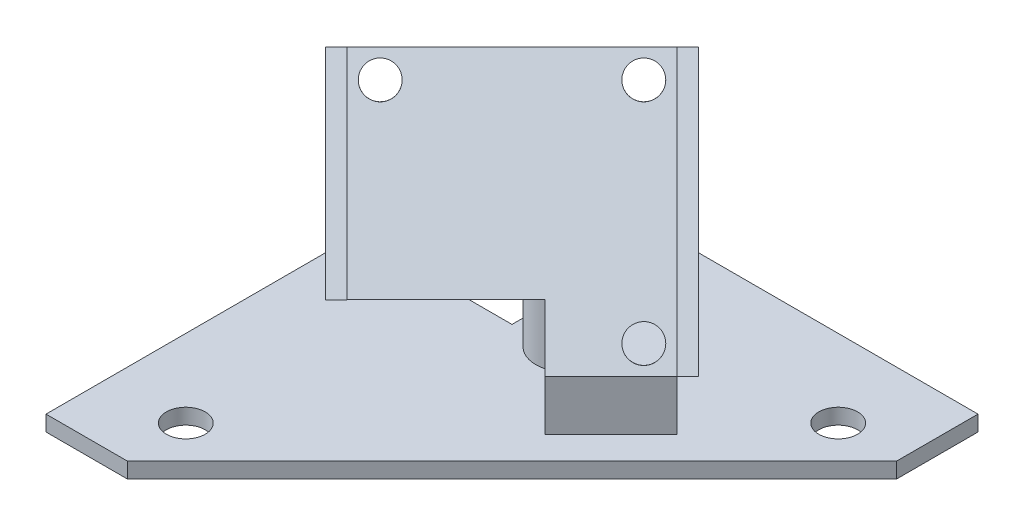
ISO-10303-21;
HEADER;
FILE_DESCRIPTION(('STEP AP214'),'2;1');
FILE_NAME('part.step','',(''),(''),'','','');
FILE_SCHEMA(('AUTOMOTIVE_DESIGN { 1 0 10303 214 1 1 1 1 }'));
ENDSEC;
DATA;
#1=APPLICATION_CONTEXT('core data for automotive mechanical design processes');
#2=APPLICATION_PROTOCOL_DEFINITION('international standard','automotive_design',2000,#1);
#3=PRODUCT_CONTEXT('',#1,'mechanical');
#4=PRODUCT('Part','Part','',(#3));
#5=PRODUCT_RELATED_PRODUCT_CATEGORY('part','',(#4));
#6=PRODUCT_DEFINITION_FORMATION('','',#4);
#7=PRODUCT_DEFINITION_CONTEXT('part definition',#1,'design');
#8=PRODUCT_DEFINITION('design','',#6,#7);
#9=PRODUCT_DEFINITION_SHAPE('','',#8);
#10=(LENGTH_UNIT() NAMED_UNIT(*) SI_UNIT(.MILLI.,.METRE.));
#11=(NAMED_UNIT(*) PLANE_ANGLE_UNIT() SI_UNIT($,.RADIAN.));
#12=(NAMED_UNIT(*) SI_UNIT($,.STERADIAN.) SOLID_ANGLE_UNIT());
#13=UNCERTAINTY_MEASURE_WITH_UNIT(LENGTH_MEASURE(1.E-05),#10,'distance_accuracy_value','');
#14=(GEOMETRIC_REPRESENTATION_CONTEXT(3) GLOBAL_UNCERTAINTY_ASSIGNED_CONTEXT((#13)) GLOBAL_UNIT_ASSIGNED_CONTEXT((#10,
#11,#12)) REPRESENTATION_CONTEXT('',''));
#15=CARTESIAN_POINT('',(0.,0.,0.));
#16=DIRECTION('',(0.,0.,1.));
#17=DIRECTION('',(1.,0.,0.));
#18=AXIS2_PLACEMENT_3D('',#15,#16,#17);
#19=CARTESIAN_POINT('',(10.,2.,52.));
#20=DIRECTION('',(0.,-1.,0.));
#21=DIRECTION('',(0.,0.,-1.));
#22=AXIS2_PLACEMENT_3D('',#19,#20,#21);
#23=CYLINDRICAL_SURFACE('',#22,2.5);
#24=CARTESIAN_POINT('',(10.,5.,52.));
#25=DIRECTION('',(0.,1.,0.));
#26=DIRECTION('',(0.,0.,1.));
#27=AXIS2_PLACEMENT_3D('',#24,#25,#26);
#28=CIRCLE('',#27,2.5);
#29=CARTESIAN_POINT('',(10.,5.,54.5));
#30=VERTEX_POINT('',#29);
#31=EDGE_CURVE('E223',#30,#30,#28,.T.);
#32=ORIENTED_EDGE('',*,*,#31,.T.);
#33=EDGE_LOOP('',(#32));
#34=FACE_BOUND('',#33,.T.);
#35=CARTESIAN_POINT('',(10.,3.,52.));
#36=DIRECTION('',(0.,-1.,0.));
#37=DIRECTION('',(0.,0.,-1.));
#38=AXIS2_PLACEMENT_3D('',#35,#36,#37);
#39=CIRCLE('',#38,2.5);
#40=CARTESIAN_POINT('',(10.,3.,49.5));
#41=VERTEX_POINT('',#40);
#42=EDGE_CURVE('E722',#41,#41,#39,.T.);
#43=ORIENTED_EDGE('',*,*,#42,.T.);
#44=EDGE_LOOP('',(#43));
#45=FACE_BOUND('',#44,.T.);
#46=ADVANCED_FACE('F37',(#34,#45),#23,.F.);
#47=CARTESIAN_POINT('',(52.,2.,10.));
#48=DIRECTION('',(0.,-1.,0.));
#49=DIRECTION('',(0.,0.,-1.));
#50=AXIS2_PLACEMENT_3D('',#47,#48,#49);
#51=CYLINDRICAL_SURFACE('',#50,2.5);
#52=CARTESIAN_POINT('',(52.,5.,10.));
#53=DIRECTION('',(0.,1.,0.));
#54=DIRECTION('',(0.,0.,1.));
#55=AXIS2_PLACEMENT_3D('',#52,#53,#54);
#56=CIRCLE('',#55,2.5);
#57=CARTESIAN_POINT('',(52.,5.,12.5));
#58=VERTEX_POINT('',#57);
#59=EDGE_CURVE('E729',#58,#58,#56,.T.);
#60=ORIENTED_EDGE('',*,*,#59,.T.);
#61=EDGE_LOOP('',(#60));
#62=FACE_BOUND('',#61,.T.);
#63=CARTESIAN_POINT('',(52.,3.,10.));
#64=DIRECTION('',(0.,-1.,0.));
#65=DIRECTION('',(0.,0.,-1.));
#66=AXIS2_PLACEMENT_3D('',#63,#64,#65);
#67=CIRCLE('',#66,2.5);
#68=CARTESIAN_POINT('',(52.,3.,7.5));
#69=VERTEX_POINT('',#68);
#70=EDGE_CURVE('E725',#69,#69,#67,.T.);
#71=ORIENTED_EDGE('',*,*,#70,.T.);
#72=EDGE_LOOP('',(#71));
#73=FACE_BOUND('',#72,.T.);
#74=ADVANCED_FACE('F39',(#62,#73),#51,.F.);
#75=CARTESIAN_POINT('',(60.,2.,0.));
#76=DIRECTION('',(1.,0.,0.));
#77=DIRECTION('',(0.,0.,-1.));
#78=AXIS2_PLACEMENT_3D('',#75,#76,#77);
#79=PLANE('',#78);
#80=DIRECTION('',(0.,-1.,0.));
#81=VECTOR('',#80,1.);
#82=CARTESIAN_POINT('',(60.,2.,10.5025253169417));
#83=LINE('',#82,#81);
#84=CARTESIAN_POINT('',(60.,5.,10.5025253169417));
#85=VERTEX_POINT('',#84);
#86=CARTESIAN_POINT('',(60.,3.,10.5025253169417));
#87=VERTEX_POINT('',#86);
#88=EDGE_CURVE('E182',#85,#87,#83,.T.);
#89=ORIENTED_EDGE('',*,*,#88,.T.);
#90=DIRECTION('',(0.,0.,1.));
#91=VECTOR('',#90,1.);
#92=CARTESIAN_POINT('',(60.,3.,0.));
#93=LINE('',#92,#91);
#94=CARTESIAN_POINT('',(60.,3.,0.));
#95=VERTEX_POINT('',#94);
#96=EDGE_CURVE('E170',#95,#87,#93,.T.);
#97=ORIENTED_EDGE('',*,*,#96,.F.);
#98=DIRECTION('',(0.,-1.,0.));
#99=VECTOR('',#98,1.);
#100=CARTESIAN_POINT('',(60.,2.,0.));
#101=LINE('',#100,#99);
#102=CARTESIAN_POINT('',(60.,5.,0.));
#103=VERTEX_POINT('',#102);
#104=EDGE_CURVE('E180',#103,#95,#101,.T.);
#105=ORIENTED_EDGE('',*,*,#104,.F.);
#106=DIRECTION('',(0.,0.,-1.));
#107=VECTOR('',#106,1.);
#108=CARTESIAN_POINT('',(60.,5.,10.5025253169417));
#109=LINE('',#108,#107);
#110=EDGE_CURVE('E219',#85,#103,#109,.T.);
#111=ORIENTED_EDGE('',*,*,#110,.F.);
#112=EDGE_LOOP('',(#89,#97,#105,#111));
#113=FACE_BOUND('',#112,.T.);
#114=ADVANCED_FACE('F178',(#113),#79,.T.);
#115=CARTESIAN_POINT('',(35.2512626584708,2.,35.2512626584708));
#116=DIRECTION('',(0.707106781186547,0.,0.707106781186547));
#117=DIRECTION('',(0.707106781186548,0.,-0.707106781186548));
#118=AXIS2_PLACEMENT_3D('',#115,#116,#117);
#119=PLANE('',#118);
#120=DIRECTION('',(0.,-1.,0.));
#121=VECTOR('',#120,1.);
#122=CARTESIAN_POINT('',(10.5025253169417,2.,60.));
#123=LINE('',#122,#121);
#124=CARTESIAN_POINT('',(10.5025253169417,5.,60.));
#125=VERTEX_POINT('',#124);
#126=CARTESIAN_POINT('',(10.5025253169417,3.,60.));
#127=VERTEX_POINT('',#126);
#128=EDGE_CURVE('E191',#125,#127,#123,.T.);
#129=ORIENTED_EDGE('',*,*,#128,.T.);
#130=DIRECTION('',(-0.707106781186548,0.,0.707106781186548));
#131=VECTOR('',#130,1.);
#132=CARTESIAN_POINT('',(60.,3.,10.5025253169417));
#133=LINE('',#132,#131);
#134=EDGE_CURVE('E183',#87,#127,#133,.T.);
#135=ORIENTED_EDGE('',*,*,#134,.F.);
#136=ORIENTED_EDGE('',*,*,#88,.F.);
#137=DIRECTION('',(0.707106781186548,0.,-0.707106781186548));
#138=VECTOR('',#137,1.);
#139=CARTESIAN_POINT('',(10.5025253169417,5.,60.));
#140=LINE('',#139,#138);
#141=EDGE_CURVE('E234',#125,#85,#140,.T.);
#142=ORIENTED_EDGE('',*,*,#141,.F.);
#143=EDGE_LOOP('',(#129,#135,#136,#142));
#144=FACE_BOUND('',#143,.T.);
#145=ADVANCED_FACE('F446',(#144),#119,.T.);
#146=CARTESIAN_POINT('',(0.,2.,60.));
#147=DIRECTION('',(0.,0.,-1.));
#148=DIRECTION('',(-1.,0.,0.));
#149=AXIS2_PLACEMENT_3D('',#146,#147,#148);
#150=PLANE('',#149);
#151=DIRECTION('',(-1.,0.,0.));
#152=VECTOR('',#151,1.);
#153=CARTESIAN_POINT('',(10.5025253169417,3.,60.));
#154=LINE('',#153,#152);
#155=CARTESIAN_POINT('',(0.,3.,60.));
#156=VERTEX_POINT('',#155);
#157=EDGE_CURVE('E739',#127,#156,#154,.T.);
#158=ORIENTED_EDGE('',*,*,#157,.F.);
#159=ORIENTED_EDGE('',*,*,#128,.F.);
#160=DIRECTION('',(1.,0.,0.));
#161=VECTOR('',#160,1.);
#162=CARTESIAN_POINT('',(0.,5.,60.));
#163=LINE('',#162,#161);
#164=CARTESIAN_POINT('',(0.,5.,60.));
#165=VERTEX_POINT('',#164);
#166=EDGE_CURVE('E231',#165,#125,#163,.T.);
#167=ORIENTED_EDGE('',*,*,#166,.F.);
#168=DIRECTION('',(0.,-1.,0.));
#169=VECTOR('',#168,1.);
#170=CARTESIAN_POINT('',(0.,2.,60.));
#171=LINE('',#170,#169);
#172=EDGE_CURVE('E200',#165,#156,#171,.T.);
#173=ORIENTED_EDGE('',*,*,#172,.T.);
#174=EDGE_LOOP('',(#158,#159,#167,#173));
#175=FACE_BOUND('',#174,.T.);
#176=ADVANCED_FACE('F442',(#175),#150,.F.);
#177=CARTESIAN_POINT('',(0.,2.,0.));
#178=DIRECTION('',(1.,0.,0.));
#179=DIRECTION('',(0.,0.,-1.));
#180=AXIS2_PLACEMENT_3D('',#177,#178,#179);
#181=PLANE('',#180);
#182=DIRECTION('',(0.,0.,-1.));
#183=VECTOR('',#182,1.);
#184=CARTESIAN_POINT('',(0.,3.,60.));
#185=LINE('',#184,#183);
#186=CARTESIAN_POINT('',(0.,3.,20.));
#187=VERTEX_POINT('',#186);
#188=EDGE_CURVE('E731',#156,#187,#185,.T.);
#189=ORIENTED_EDGE('',*,*,#188,.F.);
#190=ORIENTED_EDGE('',*,*,#172,.F.);
#191=DIRECTION('',(0.,0.,1.));
#192=VECTOR('',#191,1.);
#193=CARTESIAN_POINT('',(0.,5.,20.));
#194=LINE('',#193,#192);
#195=CARTESIAN_POINT('',(0.,5.,20.));
#196=VERTEX_POINT('',#195);
#197=EDGE_CURVE('E228',#196,#165,#194,.T.);
#198=ORIENTED_EDGE('',*,*,#197,.F.);
#199=DIRECTION('',(0.,-1.,0.));
#200=VECTOR('',#199,1.);
#201=CARTESIAN_POINT('',(0.,2.,20.));
#202=LINE('',#201,#200);
#203=EDGE_CURVE('E203',#196,#187,#202,.T.);
#204=ORIENTED_EDGE('',*,*,#203,.T.);
#205=EDGE_LOOP('',(#189,#190,#198,#204));
#206=FACE_BOUND('',#205,.T.);
#207=ADVANCED_FACE('F438',(#206),#181,.F.);
#208=CARTESIAN_POINT('',(0.,2.,20.));
#209=DIRECTION('',(0.,0.,-1.));
#210=DIRECTION('',(-1.,0.,0.));
#211=AXIS2_PLACEMENT_3D('',#208,#209,#210);
#212=PLANE('',#211);
#213=DIRECTION('',(0.,-1.,0.));
#214=VECTOR('',#213,1.);
#215=CARTESIAN_POINT('',(20.,2.,20.));
#216=LINE('',#215,#214);
#217=CARTESIAN_POINT('',(20.,5.,20.));
#218=VERTEX_POINT('',#217);
#219=CARTESIAN_POINT('',(20.,3.,20.));
#220=VERTEX_POINT('',#219);
#221=EDGE_CURVE('E206',#218,#220,#216,.T.);
#222=ORIENTED_EDGE('',*,*,#221,.T.);
#223=DIRECTION('',(1.,0.,0.));
#224=VECTOR('',#223,1.);
#225=CARTESIAN_POINT('',(0.,3.,20.));
#226=LINE('',#225,#224);
#227=EDGE_CURVE('E727',#187,#220,#226,.T.);
#228=ORIENTED_EDGE('',*,*,#227,.F.);
#229=ORIENTED_EDGE('',*,*,#203,.F.);
#230=DIRECTION('',(-1.,0.,0.));
#231=VECTOR('',#230,1.);
#232=CARTESIAN_POINT('',(20.,5.,20.));
#233=LINE('',#232,#231);
#234=EDGE_CURVE('E221',#218,#196,#233,.T.);
#235=ORIENTED_EDGE('',*,*,#234,.F.);
#236=EDGE_LOOP('',(#222,#228,#229,#235));
#237=FACE_BOUND('',#236,.T.);
#238=ADVANCED_FACE('F435',(#237),#212,.T.);
#239=CARTESIAN_POINT('',(20.,2.,0.));
#240=DIRECTION('',(1.,0.,0.));
#241=DIRECTION('',(0.,0.,-1.));
#242=AXIS2_PLACEMENT_3D('',#239,#240,#241);
#243=PLANE('',#242);
#244=DIRECTION('',(0.,0.,-1.));
#245=VECTOR('',#244,1.);
#246=CARTESIAN_POINT('',(20.,3.,20.));
#247=LINE('',#246,#245);
#248=CARTESIAN_POINT('',(20.,3.,0.));
#249=VERTEX_POINT('',#248);
#250=EDGE_CURVE('E52',#220,#249,#247,.T.);
#251=ORIENTED_EDGE('',*,*,#250,.F.);
#252=ORIENTED_EDGE('',*,*,#221,.F.);
#253=DIRECTION('',(0.,0.,1.));
#254=VECTOR('',#253,1.);
#255=CARTESIAN_POINT('',(20.,5.,0.));
#256=LINE('',#255,#254);
#257=CARTESIAN_POINT('',(20.,5.,0.));
#258=VERTEX_POINT('',#257);
#259=EDGE_CURVE('E212',#258,#218,#256,.T.);
#260=ORIENTED_EDGE('',*,*,#259,.F.);
#261=DIRECTION('',(0.,-1.,0.));
#262=VECTOR('',#261,1.);
#263=CARTESIAN_POINT('',(20.,2.,0.));
#264=LINE('',#263,#262);
#265=EDGE_CURVE('E45',#258,#249,#264,.T.);
#266=ORIENTED_EDGE('',*,*,#265,.T.);
#267=EDGE_LOOP('',(#251,#252,#260,#266));
#268=FACE_BOUND('',#267,.T.);
#269=ADVANCED_FACE('F210',(#268),#243,.F.);
#270=CARTESIAN_POINT('',(0.,2.,0.));
#271=DIRECTION('',(0.,0.,-1.));
#272=DIRECTION('',(-1.,0.,0.));
#273=AXIS2_PLACEMENT_3D('',#270,#271,#272);
#274=PLANE('',#273);
#275=ORIENTED_EDGE('',*,*,#104,.T.);
#276=DIRECTION('',(1.,0.,0.));
#277=VECTOR('',#276,1.);
#278=CARTESIAN_POINT('',(20.,3.,0.));
#279=LINE('',#278,#277);
#280=EDGE_CURVE('E167',#249,#95,#279,.T.);
#281=ORIENTED_EDGE('',*,*,#280,.F.);
#282=ORIENTED_EDGE('',*,*,#265,.F.);
#283=DIRECTION('',(-1.,0.,0.));
#284=VECTOR('',#283,1.);
#285=CARTESIAN_POINT('',(60.,5.,0.));
#286=LINE('',#285,#284);
#287=EDGE_CURVE('E187',#103,#258,#286,.T.);
#288=ORIENTED_EDGE('',*,*,#287,.F.);
#289=EDGE_LOOP('',(#275,#281,#282,#288));
#290=FACE_BOUND('',#289,.T.);
#291=ADVANCED_FACE('F185',(#290),#274,.T.);
#292=CARTESIAN_POINT('',(36.083472955532,25.2282933289435,14.8702695199356));
#293=DIRECTION('',(-0.707106781186547,0.,0.707106781186548));
#294=DIRECTION('',(0.707106781186548,0.,0.707106781186547));
#295=AXIS2_PLACEMENT_3D('',#292,#293,#294);
#296=PLANE('',#295);
#297=DIRECTION('',(0.,-1.,0.));
#298=VECTOR('',#297,1.);
#299=CARTESIAN_POINT('',(42.8915475218258,500000.,21.6783440862294));
#300=LINE('',#299,#298);
#301=CARTESIAN_POINT('',(42.8915475218258,11.4779823712564,21.6783440862294));
#302=VERTEX_POINT('',#301);
#303=CARTESIAN_POINT('',(42.8915475218258,5.00000000010914,21.6783440862294));
#304=VERTEX_POINT('',#303);
#305=EDGE_CURVE('E298',#302,#304,#300,.T.);
#306=ORIENTED_EDGE('',*,*,#305,.T.);
#307=DIRECTION('',(-0.707106781186548,0.,-0.707106781186547));
#308=VECTOR('',#307,1.);
#309=CARTESIAN_POINT('',(36.083472955532,5.,14.8702695199356));
#310=LINE('',#309,#308);
#311=CARTESIAN_POINT('',(41.7330915911169,5.,20.5198881555205));
#312=VERTEX_POINT('',#311);
#313=EDGE_CURVE('E60',#304,#312,#310,.T.);
#314=ORIENTED_EDGE('',*,*,#313,.T.);
#315=DIRECTION('',(0.,-1.,0.));
#316=VECTOR('',#315,1.);
#317=CARTESIAN_POINT('',(41.7330915911467,500000.,20.5198881555502));
#318=LINE('',#317,#316);
#319=CARTESIAN_POINT('',(41.7330915911467,10.3308294985543,20.5198881555502));
#320=VERTEX_POINT('',#319);
#321=EDGE_CURVE('E295',#320,#312,#318,.T.);
#322=ORIENTED_EDGE('',*,*,#321,.F.);
#323=DIRECTION('',(-0.57922796533957,-0.573576436351044,-0.57922796533957));
#324=VECTOR('',#323,1.);
#325=CARTESIAN_POINT('',(44.6292314178446,13.1987116803095,23.4160279822481));
#326=LINE('',#325,#324);
#327=EDGE_CURVE('E265',#302,#320,#326,.T.);
#328=ORIENTED_EDGE('',*,*,#327,.F.);
#329=EDGE_LOOP('',(#306,#314,#322,#328));
#330=FACE_BOUND('',#329,.T.);
#331=ADVANCED_FACE('F372',(#330),#296,.F.);
#332=CARTESIAN_POINT('',(26.0301640550348,43.283929457579,18.9590962431693));
#333=DIRECTION('',(0.,-1.,0.));
#334=DIRECTION('',(0.,0.,-1.));
#335=AXIS2_PLACEMENT_3D('',#332,#333,#334);
#336=CYLINDRICAL_SURFACE('',#335,4.);
#337=CARTESIAN_POINT('',(26.0301640550348,5.,18.9590962431693));
#338=DIRECTION('',(0.,1.,0.));
#339=DIRECTION('',(0.,0.,1.));
#340=AXIS2_PLACEMENT_3D('',#337,#338,#339);
#341=CIRCLE('',#340,4.);
#342=CARTESIAN_POINT('',(26.0301640550348,5.,22.9590962431693));
#343=VERTEX_POINT('',#342);
#344=EDGE_CURVE('E242',#343,#343,#341,.T.);
#345=ORIENTED_EDGE('',*,*,#344,.T.);
#346=EDGE_LOOP('',(#345));
#347=FACE_BOUND('',#346,.T.);
#348=CARTESIAN_POINT('',(26.0301640550348,27.7646507935135,18.9590962431693));
#349=DIRECTION('',(0.57922796533957,0.573576436351044,0.57922796533957));
#350=DIRECTION('',(0.405579787672638,-0.819152044288993,0.405579787672638));
#351=AXIS2_PLACEMENT_3D('',#348,#349,#350);
#352=ELLIPSE('',#351,6.97378718248442,4.);
#353=CARTESIAN_POINT('',(28.858591179781,22.052058766545,21.7875233679155));
#354=VERTEX_POINT('',#353);
#355=EDGE_CURVE('E189',#354,#354,#352,.T.);
#356=ORIENTED_EDGE('',*,*,#355,.F.);
#357=EDGE_LOOP('',(#356));
#358=FACE_BOUND('',#357,.T.);
#359=ADVANCED_FACE('F397',(#347,#358),#336,.T.);
#360=CARTESIAN_POINT('',(27.5981915812934,25.2282933289435,23.3555508941741));
#361=DIRECTION('',(-0.707106781186547,0.,0.707106781186548));
#362=DIRECTION('',(0.707106781186548,0.,0.707106781186547));
#363=AXIS2_PLACEMENT_3D('',#360,#361,#362);
#364=PLANE('',#363);
#365=DIRECTION('',(-0.707106781186548,0.,-0.707106781186547));
#366=VECTOR('',#365,1.);
#367=CARTESIAN_POINT('',(27.5981915812934,5.,23.3555508941741));
#368=LINE('',#367,#366);
#369=CARTESIAN_POINT('',(34.4062661475873,4.99999999999545,30.163625460468));
#370=VERTEX_POINT('',#369);
#371=CARTESIAN_POINT('',(33.2478102169095,5.,29.0051695297902));
#372=VERTEX_POINT('',#371);
#373=EDGE_CURVE('E236',#370,#372,#368,.T.);
#374=ORIENTED_EDGE('',*,*,#373,.F.);
#375=DIRECTION('',(0.,-1.,0.));
#376=VECTOR('',#375,1.);
#377=CARTESIAN_POINT('',(34.4062661475873,500000.,30.163625460468));
#378=LINE('',#377,#376);
#379=CARTESIAN_POINT('',(34.4062661475873,11.4779823712564,30.163625460468));
#380=VERTEX_POINT('',#379);
#381=EDGE_CURVE('E301',#380,#370,#378,.T.);
#382=ORIENTED_EDGE('',*,*,#381,.F.);
#383=DIRECTION('',(-0.405579787672638,0.819152044288993,-0.405579787672637));
#384=VECTOR('',#383,1.);
#385=CARTESIAN_POINT('',(27.5981915812934,25.2282933289435,23.3555508941741));
#386=LINE('',#385,#384);
#387=CARTESIAN_POINT('',(31.5672076338788,17.2120466812793,27.3245669467595));
#388=VERTEX_POINT('',#387);
#389=EDGE_CURVE('E311',#380,#388,#386,.T.);
#390=ORIENTED_EDGE('',*,*,#389,.T.);
#391=DIRECTION('',(-0.57922796533957,-0.573576436351044,-0.57922796533957));
#392=VECTOR('',#391,1.);
#393=CARTESIAN_POINT('',(31.5672076338788,17.2120466812793,27.3245669467595));
#394=LINE('',#393,#392);
#395=CARTESIAN_POINT('',(30.4087517031996,16.0648938085772,26.1661110160803));
#396=VERTEX_POINT('',#395);
#397=EDGE_CURVE('E194',#388,#396,#394,.T.);
#398=ORIENTED_EDGE('',*,*,#397,.T.);
#399=DIRECTION('',(-0.405579787672638,0.819152044288993,-0.405579787672637));
#400=VECTOR('',#399,1.);
#401=CARTESIAN_POINT('',(26.4397356506143,24.0811404562414,22.197094963495));
#402=LINE('',#401,#400);
#403=CARTESIAN_POINT('',(33.2478102169109,10.3308294985653,29.0051695297916));
#404=VERTEX_POINT('',#403);
#405=EDGE_CURVE('E336',#404,#396,#402,.T.);
#406=ORIENTED_EDGE('',*,*,#405,.F.);
#407=DIRECTION('',(0.,-1.,0.));
#408=VECTOR('',#407,1.);
#409=CARTESIAN_POINT('',(33.2478102169081,500000.,29.0051695297888));
#410=LINE('',#409,#408);
#411=EDGE_CURVE('E304',#404,#372,#410,.T.);
#412=ORIENTED_EDGE('',*,*,#411,.T.);
#413=EDGE_LOOP('',(#374,#382,#390,#398,#406,#412));
#414=FACE_BOUND('',#413,.T.);
#415=ADVANCED_FACE('F354',(#414),#364,.T.);
#416=CARTESIAN_POINT('',(20.1175521738485,36.0525436999262,20.1175521738485));
#417=DIRECTION('',(0.405579787672638,-0.819152044288993,0.405579787672638));
#418=DIRECTION('',(0.896169137511728,0.443712606279656,0.));
#419=AXIS2_PLACEMENT_3D('',#416,#417,#418);
#420=PLANE('',#419);
#421=DIRECTION('',(-0.707106781186547,0.,0.707106781186548));
#422=VECTOR('',#421,1.);
#423=CARTESIAN_POINT('',(18.9590962431693,34.9053908272241,18.9590962431693));
#424=LINE('',#423,#422);
#425=CARTESIAN_POINT('',(30.9799115233406,34.9053908272241,6.93828096299801));
#426=VERTEX_POINT('',#425);
#427=CARTESIAN_POINT('',(6.93828096299803,34.9053908272241,30.9799115233406));
#428=VERTEX_POINT('',#427);
#429=EDGE_CURVE('E341',#426,#428,#424,.T.);
#430=ORIENTED_EDGE('',*,*,#429,.T.);
#431=DIRECTION('',(-0.57922796533957,-0.573576436351044,-0.57922796533957));
#432=VECTOR('',#431,1.);
#433=CARTESIAN_POINT('',(9.83442078969589,37.7732730089793,33.8760513500385));
#434=LINE('',#433,#432);
#435=CARTESIAN_POINT('',(9.83442078969589,37.7732730089793,33.8760513500385));
#436=VERTEX_POINT('',#435);
#437=EDGE_CURVE('E292',#436,#428,#434,.T.);
#438=ORIENTED_EDGE('',*,*,#437,.F.);
#439=DIRECTION('',(-0.707106781186548,0.,0.707106781186548));
#440=VECTOR('',#439,1.);
#441=CARTESIAN_POINT('',(11.248634352069,37.7732730089793,32.4618377876654));
#442=LINE('',#441,#440);
#443=CARTESIAN_POINT('',(11.248634352069,37.7732730089793,32.4618377876654));
#444=VERTEX_POINT('',#443);
#445=EDGE_CURVE('E275',#444,#436,#442,.T.);
#446=ORIENTED_EDGE('',*,*,#445,.F.);
#447=DIRECTION('',(-0.57922796533957,-0.573576436351044,-0.57922796533957));
#448=VECTOR('',#447,1.);
#449=CARTESIAN_POINT('',(11.248634352069,37.7732730089793,32.4618377876654));
#450=LINE('',#449,#448);
#451=CARTESIAN_POINT('',(9.51095045605027,36.0525436999262,30.7241538916467));
#452=VERTEX_POINT('',#451);
#453=EDGE_CURVE('E284',#444,#452,#450,.T.);
#454=ORIENTED_EDGE('',*,*,#453,.T.);
#455=DIRECTION('',(-0.707106781186547,0.,0.707106781186548));
#456=VECTOR('',#455,1.);
#457=CARTESIAN_POINT('',(20.1175521738485,36.0525436999262,20.1175521738485));
#458=LINE('',#457,#456);
#459=CARTESIAN_POINT('',(30.7241538916467,36.0525436999262,9.51095045605025));
#460=VERTEX_POINT('',#459);
#461=EDGE_CURVE('E321',#460,#452,#458,.T.);
#462=ORIENTED_EDGE('',*,*,#461,.F.);
#463=DIRECTION('',(-0.57922796533957,-0.573576436351044,-0.57922796533957));
#464=VECTOR('',#463,1.);
#465=CARTESIAN_POINT('',(32.4618377876654,37.7732730089793,11.248634352069));
#466=LINE('',#465,#464);
#467=CARTESIAN_POINT('',(32.4618377876654,37.7732730089793,11.248634352069));
#468=VERTEX_POINT('',#467);
#469=EDGE_CURVE('E269',#468,#460,#466,.T.);
#470=ORIENTED_EDGE('',*,*,#469,.F.);
#471=DIRECTION('',(-0.707106781186547,0.,0.707106781186548));
#472=VECTOR('',#471,1.);
#473=CARTESIAN_POINT('',(32.4618377876654,37.7732730089793,11.248634352069));
#474=LINE('',#473,#472);
#475=CARTESIAN_POINT('',(33.8760513500385,37.7732730089793,9.83442078969587));
#476=VERTEX_POINT('',#475);
#477=EDGE_CURVE('E251',#476,#468,#474,.T.);
#478=ORIENTED_EDGE('',*,*,#477,.F.);
#479=DIRECTION('',(-0.57922796533957,-0.573576436351044,-0.57922796533957));
#480=VECTOR('',#479,1.);
#481=CARTESIAN_POINT('',(33.8760513500385,37.7732730089793,9.83442078969587));
#482=LINE('',#481,#480);
#483=EDGE_CURVE('E260',#476,#426,#482,.T.);
#484=ORIENTED_EDGE('',*,*,#483,.T.);
#485=EDGE_LOOP('',(#430,#438,#446,#454,#462,#470,#478,#484));
#486=FACE_BOUND('',#485,.T.);
#487=ADVANCED_FACE('F498',(#486),#420,.F.);
#488=CARTESIAN_POINT('',(12.8490101626278,33.5950875670592,29.819572911105));
#489=DIRECTION('',(-0.57922796533957,-0.573576436351044,-0.57922796533957));
#490=DIRECTION('',(-0.707106781186547,0.,0.707106781186548));
#491=AXIS2_PLACEMENT_3D('',#488,#489,#490);
#492=CYLINDRICAL_SURFACE('',#491,2.);
#493=CARTESIAN_POINT('',(12.8490101626278,33.5950875670592,29.819572911105));
#494=DIRECTION('',(0.57922796533957,0.573576436351044,0.57922796533957));
#495=DIRECTION('',(0.707106781186547,0.,-0.707106781186548));
#496=AXIS2_PLACEMENT_3D('',#493,#494,#495);
#497=CIRCLE('',#496,2.);
#498=CARTESIAN_POINT('',(14.2632237250009,33.5950875670592,28.4053593487319));
#499=VERTEX_POINT('',#498);
#500=EDGE_CURVE('E328',#499,#499,#497,.T.);
#501=ORIENTED_EDGE('',*,*,#500,.T.);
#502=EDGE_LOOP('',(#501));
#503=FACE_BOUND('',#502,.T.);
#504=CARTESIAN_POINT('',(11.6905542319487,32.4479346943571,28.6611169804258));
#505=DIRECTION('',(0.57922796533957,0.573576436351044,0.57922796533957));
#506=DIRECTION('',(0.707106781186547,0.,-0.707106781186548));
#507=AXIS2_PLACEMENT_3D('',#504,#505,#506);
#508=CIRCLE('',#507,2.);
#509=CARTESIAN_POINT('',(13.1047677943218,32.4479346943571,27.2469034180527));
#510=VERTEX_POINT('',#509);
#511=EDGE_CURVE('E346',#510,#510,#508,.T.);
#512=ORIENTED_EDGE('',*,*,#511,.F.);
#513=EDGE_LOOP('',(#512));
#514=FACE_BOUND('',#513,.T.);
#515=ADVANCED_FACE('F419',(#503,#514),#492,.F.);
#516=CARTESIAN_POINT('',(29.4458872903191,17.2120466812793,29.4458872903191));
#517=DIRECTION('',(-0.405579787672638,0.819152044288993,-0.405579787672637));
#518=DIRECTION('',(-0.896169137511728,-0.443712606279657,0.));
#519=AXIS2_PLACEMENT_3D('',#516,#517,#518);
#520=PLANE('',#519);
#521=DIRECTION('',(0.707106781186547,0.,-0.707106781186548));
#522=VECTOR('',#521,1.);
#523=CARTESIAN_POINT('',(28.28743135964,16.0648938085772,28.28743135964));
#524=LINE('',#523,#522);
#525=CARTESIAN_POINT('',(16.2666160794687,16.0648938085772,40.3082466398113));
#526=VERTEX_POINT('',#525);
#527=EDGE_CURVE('E343',#526,#396,#524,.T.);
#528=ORIENTED_EDGE('',*,*,#527,.T.);
#529=ORIENTED_EDGE('',*,*,#397,.F.);
#530=DIRECTION('',(0.707106781186547,0.,-0.707106781186548));
#531=VECTOR('',#530,1.);
#532=CARTESIAN_POINT('',(29.4458872903191,17.2120466812793,29.4458872903191));
#533=LINE('',#532,#531);
#534=CARTESIAN_POINT('',(18.8392855725209,17.2120466812793,40.0524890081173));
#535=VERTEX_POINT('',#534);
#536=EDGE_CURVE('E326',#535,#388,#533,.T.);
#537=ORIENTED_EDGE('',*,*,#536,.F.);
#538=DIRECTION('',(-0.57922796533957,-0.573576436351044,-0.57922796533957));
#539=VECTOR('',#538,1.);
#540=CARTESIAN_POINT('',(20.5769694685397,18.9327759903325,41.7901729041361));
#541=LINE('',#540,#539);
#542=CARTESIAN_POINT('',(20.5769694685397,18.9327759903325,41.7901729041361));
#543=VERTEX_POINT('',#542);
#544=EDGE_CURVE('E287',#543,#535,#541,.T.);
#545=ORIENTED_EDGE('',*,*,#544,.F.);
#546=DIRECTION('',(0.707106781186549,0.,-0.707106781186546));
#547=VECTOR('',#546,1.);
#548=CARTESIAN_POINT('',(20.5769694685397,18.9327759903325,41.7901729041361));
#549=LINE('',#548,#547);
#550=CARTESIAN_POINT('',(19.1627559061666,18.9327759903325,43.2043864665091));
#551=VERTEX_POINT('',#550);
#552=EDGE_CURVE('E280',#551,#543,#549,.T.);
#553=ORIENTED_EDGE('',*,*,#552,.F.);
#554=DIRECTION('',(-0.57922796533957,-0.573576436351044,-0.57922796533957));
#555=VECTOR('',#554,1.);
#556=CARTESIAN_POINT('',(19.1627559061666,18.9327759903325,43.2043864665091));
#557=LINE('',#556,#555);
#558=EDGE_CURVE('E289',#551,#526,#557,.T.);
#559=ORIENTED_EDGE('',*,*,#558,.T.);
#560=EDGE_LOOP('',(#528,#529,#537,#545,#553,#559));
#561=FACE_BOUND('',#560,.T.);
#562=ADVANCED_FACE('F359',(#561),#520,.F.);
#563=CARTESIAN_POINT('',(39.5534878152483,13.9354385041234,22.5829250667711));
#564=DIRECTION('',(-0.57922796533957,-0.573576436351044,-0.57922796533957));
#565=DIRECTION('',(-0.707106781186547,0.,0.707106781186548));
#566=AXIS2_PLACEMENT_3D('',#563,#564,#565);
#567=CYLINDRICAL_SURFACE('',#566,1.99999999999999);
#568=CARTESIAN_POINT('',(39.5534878152483,13.9354385041234,22.5829250667711));
#569=DIRECTION('',(0.57922796533957,0.573576436351044,0.57922796533957));
#570=DIRECTION('',(0.707106781186547,0.,-0.707106781186548));
#571=AXIS2_PLACEMENT_3D('',#568,#569,#570);
#572=CIRCLE('',#571,1.99999999999999);
#573=CARTESIAN_POINT('',(40.9677013776214,13.9354385041234,21.168711504398));
#574=VERTEX_POINT('',#573);
#575=EDGE_CURVE('E308',#574,#574,#572,.T.);
#576=ORIENTED_EDGE('',*,*,#575,.T.);
#577=EDGE_LOOP('',(#576));
#578=FACE_BOUND('',#577,.T.);
#579=CARTESIAN_POINT('',(38.3950318845691,12.7882856314213,21.424469136092));
#580=DIRECTION('',(0.57922796533957,0.573576436351044,0.57922796533957));
#581=DIRECTION('',(0.707106781186547,0.,-0.707106781186548));
#582=AXIS2_PLACEMENT_3D('',#579,#580,#581);
#583=CIRCLE('',#582,1.99999999999999);
#584=CARTESIAN_POINT('',(39.8092454469422,12.7882856314213,20.0102555737189));
#585=VERTEX_POINT('',#584);
#586=EDGE_CURVE('E307',#585,#585,#583,.T.);
#587=ORIENTED_EDGE('',*,*,#586,.F.);
#588=EDGE_LOOP('',(#587));
#589=FACE_BOUND('',#588,.T.);
#590=ADVANCED_FACE('F408',(#578,#589),#567,.F.);
#591=CARTESIAN_POINT('',(29.819572911105,33.5950875670592,12.8490101626278));
#592=DIRECTION('',(-0.57922796533957,-0.573576436351044,-0.57922796533957));
#593=DIRECTION('',(-0.707106781186547,0.,0.707106781186548));
#594=AXIS2_PLACEMENT_3D('',#591,#592,#593);
#595=CYLINDRICAL_SURFACE('',#594,2.);
#596=CARTESIAN_POINT('',(29.819572911105,33.5950875670592,12.8490101626278));
#597=DIRECTION('',(0.57922796533957,0.573576436351044,0.57922796533957));
#598=DIRECTION('',(0.707106781186547,0.,-0.707106781186548));
#599=AXIS2_PLACEMENT_3D('',#596,#597,#598);
#600=CIRCLE('',#599,2.);
#601=CARTESIAN_POINT('',(31.2337864734781,33.5950875670592,11.4347966002547));
#602=VERTEX_POINT('',#601);
#603=EDGE_CURVE('E331',#602,#602,#600,.F.);
#604=ORIENTED_EDGE('',*,*,#603,.F.);
#605=EDGE_LOOP('',(#604));
#606=FACE_BOUND('',#605,.T.);
#607=CARTESIAN_POINT('',(28.6611169804258,32.4479346943571,11.6905542319487));
#608=DIRECTION('',(0.57922796533957,0.573576436351044,0.57922796533957));
#609=DIRECTION('',(0.707106781186547,0.,-0.707106781186548));
#610=AXIS2_PLACEMENT_3D('',#607,#608,#609);
#611=CIRCLE('',#610,2.);
#612=CARTESIAN_POINT('',(30.0753305427989,32.4479346943571,10.2763406695756));
#613=VERTEX_POINT('',#612);
#614=EDGE_CURVE('E312',#613,#613,#611,.F.);
#615=ORIENTED_EDGE('',*,*,#614,.T.);
#616=EDGE_LOOP('',(#615));
#617=FACE_BOUND('',#616,.T.);
#618=ADVANCED_FACE('F410',(#606,#617),#595,.F.);
#619=CARTESIAN_POINT('',(25.4768712377338,25.2282933289435,25.4768712377338));
#620=DIRECTION('',(0.57922796533957,0.573576436351044,0.57922796533957));
#621=DIRECTION('',(0.707106781186547,0.,-0.707106781186548));
#622=AXIS2_PLACEMENT_3D('',#619,#620,#621);
#623=PLANE('',#622);
#624=ORIENTED_EDGE('',*,*,#575,.F.);
#625=EDGE_LOOP('',(#624));
#626=FACE_BOUND('',#625,.T.);
#627=ORIENTED_EDGE('',*,*,#389,.F.);
#628=DIRECTION('',(-0.707106781186547,0.,0.707106781186548));
#629=VECTOR('',#628,1.);
#630=CARTESIAN_POINT('',(32.2849458040276,11.4779823712564,32.2849458040276));
#631=LINE('',#630,#629);
#632=EDGE_CURVE('E315',#302,#380,#631,.T.);
#633=ORIENTED_EDGE('',*,*,#632,.F.);
#634=DIRECTION('',(-0.405579787672638,0.819152044288993,-0.405579787672638));
#635=VECTOR('',#634,1.);
#636=CARTESIAN_POINT('',(36.083472955532,25.2282933289435,14.8702695199356));
#637=LINE('',#636,#635);
#638=EDGE_CURVE('E318',#302,#460,#637,.T.);
#639=ORIENTED_EDGE('',*,*,#638,.T.);
#640=ORIENTED_EDGE('',*,*,#461,.T.);
#641=DIRECTION('',(-0.405579787672638,0.819152044288993,-0.405579787672638));
#642=VECTOR('',#641,1.);
#643=CARTESIAN_POINT('',(14.8702695199356,25.2282933289435,36.083472955532));
#644=LINE('',#643,#642);
#645=EDGE_CURVE('E324',#535,#452,#644,.T.);
#646=ORIENTED_EDGE('',*,*,#645,.F.);
#647=ORIENTED_EDGE('',*,*,#536,.T.);
#648=EDGE_LOOP('',(#627,#633,#639,#640,#646,#647));
#649=FACE_BOUND('',#648,.T.);
#650=ORIENTED_EDGE('',*,*,#500,.F.);
#651=EDGE_LOOP('',(#650));
#652=FACE_BOUND('',#651,.T.);
#653=ORIENTED_EDGE('',*,*,#603,.T.);
#654=EDGE_LOOP('',(#653));
#655=FACE_BOUND('',#654,.T.);
#656=ADVANCED_FACE('F384',(#626,#649,#652,#655),#623,.T.);
#657=CARTESIAN_POINT('',(24.3184153070547,24.0811404562414,24.3184153070546));
#658=DIRECTION('',(0.57922796533957,0.573576436351044,0.57922796533957));
#659=DIRECTION('',(0.707106781186547,0.,-0.707106781186548));
#660=AXIS2_PLACEMENT_3D('',#657,#658,#659);
#661=PLANE('',#660);
#662=ORIENTED_EDGE('',*,*,#355,.T.);
#663=EDGE_LOOP('',(#662));
#664=FACE_BOUND('',#663,.T.);
#665=ORIENTED_EDGE('',*,*,#586,.T.);
#666=EDGE_LOOP('',(#665));
#667=FACE_BOUND('',#666,.T.);
#668=ORIENTED_EDGE('',*,*,#405,.T.);
#669=ORIENTED_EDGE('',*,*,#527,.F.);
#670=DIRECTION('',(-0.405579787672638,0.819152044288993,-0.405579787672637));
#671=VECTOR('',#670,1.);
#672=CARTESIAN_POINT('',(6.93828096299802,34.9053908272241,30.9799115233406));
#673=LINE('',#672,#671);
#674=EDGE_CURVE('E272',#526,#428,#673,.T.);
#675=ORIENTED_EDGE('',*,*,#674,.T.);
#676=ORIENTED_EDGE('',*,*,#429,.F.);
#677=DIRECTION('',(0.405579787672638,-0.819152044288993,0.405579787672637));
#678=VECTOR('',#677,1.);
#679=CARTESIAN_POINT('',(30.9799115233406,34.9053908272241,6.93828096299801));
#680=LINE('',#679,#678);
#681=CARTESIAN_POINT('',(43.1473051535198,10.3308294985543,19.1056745931771));
#682=VERTEX_POINT('',#681);
#683=EDGE_CURVE('E248',#426,#682,#680,.T.);
#684=ORIENTED_EDGE('',*,*,#683,.T.);
#685=DIRECTION('',(-0.707106781186547,0.,0.707106781186548));
#686=VECTOR('',#685,1.);
#687=CARTESIAN_POINT('',(41.7330915911467,10.3308294985543,20.5198881555502));
#688=LINE('',#687,#686);
#689=EDGE_CURVE('E245',#682,#320,#688,.T.);
#690=ORIENTED_EDGE('',*,*,#689,.T.);
#691=DIRECTION('',(-0.707106781186547,0.,0.707106781186548));
#692=VECTOR('',#691,1.);
#693=CARTESIAN_POINT('',(31.1264898733485,10.3308294985543,31.1264898733485));
#694=LINE('',#693,#692);
#695=EDGE_CURVE('E339',#320,#404,#694,.T.);
#696=ORIENTED_EDGE('',*,*,#695,.T.);
#697=EDGE_LOOP('',(#668,#669,#675,#676,#684,#690,#696));
#698=FACE_BOUND('',#697,.T.);
#699=ORIENTED_EDGE('',*,*,#511,.T.);
#700=EDGE_LOOP('',(#699));
#701=FACE_BOUND('',#700,.T.);
#702=ORIENTED_EDGE('',*,*,#614,.F.);
#703=EDGE_LOOP('',(#702));
#704=FACE_BOUND('',#703,.T.);
#705=ADVANCED_FACE('F364',(#664,#667,#698,#701,#704),#661,.F.);
#706=CARTESIAN_POINT('',(31.1264898733485,500000.,31.1264898733485));
#707=DIRECTION('',(0.707106781186547,0.,0.707106781186548));
#708=DIRECTION('',(0.707106781186548,0.,-0.707106781186547));
#709=AXIS2_PLACEMENT_3D('',#706,#707,#708);
#710=PLANE('',#709);
#711=ORIENTED_EDGE('',*,*,#321,.T.);
#712=DIRECTION('',(-0.707106781186548,0.,0.707106781186547));
#713=VECTOR('',#712,1.);
#714=CARTESIAN_POINT('',(31.1264898733485,4.99999999999545,31.1264898733485));
#715=LINE('',#714,#713);
#716=EDGE_CURVE('E239',#312,#372,#715,.T.);
#717=ORIENTED_EDGE('',*,*,#716,.T.);
#718=ORIENTED_EDGE('',*,*,#411,.F.);
#719=ORIENTED_EDGE('',*,*,#695,.F.);
#720=EDGE_LOOP('',(#711,#717,#718,#719));
#721=FACE_BOUND('',#720,.T.);
#722=ADVANCED_FACE('F369',(#721),#710,.F.);
#723=CARTESIAN_POINT('',(32.2849458040276,500000.,32.2849458040276));
#724=DIRECTION('',(-0.707106781186547,0.,-0.707106781186548));
#725=DIRECTION('',(-0.707106781186548,0.,0.707106781186547));
#726=AXIS2_PLACEMENT_3D('',#723,#724,#725);
#727=PLANE('',#726);
#728=ORIENTED_EDGE('',*,*,#381,.T.);
#729=DIRECTION('',(0.707106781186548,0.,-0.707106781186547));
#730=VECTOR('',#729,1.);
#731=CARTESIAN_POINT('',(32.2849458040276,4.99999999999545,32.2849458040276));
#732=LINE('',#731,#730);
#733=EDGE_CURVE('E11',#370,#304,#732,.T.);
#734=ORIENTED_EDGE('',*,*,#733,.T.);
#735=ORIENTED_EDGE('',*,*,#305,.F.);
#736=ORIENTED_EDGE('',*,*,#632,.T.);
#737=EDGE_LOOP('',(#728,#734,#735,#736));
#738=FACE_BOUND('',#737,.T.);
#739=ADVANCED_FACE('F389',(#738),#727,.F.);
#740=CARTESIAN_POINT('',(9.83442078969589,37.7732730089793,33.8760513500385));
#741=DIRECTION('',(0.707106781186547,0.,-0.707106781186548));
#742=DIRECTION('',(-0.707106781186548,0.,-0.707106781186547));
#743=AXIS2_PLACEMENT_3D('',#740,#741,#742);
#744=PLANE('',#743);
#745=ORIENTED_EDGE('',*,*,#437,.T.);
#746=ORIENTED_EDGE('',*,*,#674,.F.);
#747=ORIENTED_EDGE('',*,*,#558,.F.);
#748=DIRECTION('',(0.405579787672638,-0.819152044288993,0.405579787672637));
#749=VECTOR('',#748,1.);
#750=CARTESIAN_POINT('',(9.83442078969589,37.7732730089793,33.8760513500385));
#751=LINE('',#750,#749);
#752=EDGE_CURVE('E278',#436,#551,#751,.T.);
#753=ORIENTED_EDGE('',*,*,#752,.F.);
#754=EDGE_LOOP('',(#745,#746,#747,#753));
#755=FACE_BOUND('',#754,.T.);
#756=ADVANCED_FACE('F544',(#755),#744,.F.);
#757=CARTESIAN_POINT('',(11.248634352069,37.7732730089793,32.4618377876654));
#758=DIRECTION('',(-0.707106781186547,0.,0.707106781186548));
#759=DIRECTION('',(0.707106781186548,0.,0.707106781186547));
#760=AXIS2_PLACEMENT_3D('',#757,#758,#759);
#761=PLANE('',#760);
#762=ORIENTED_EDGE('',*,*,#645,.T.);
#763=ORIENTED_EDGE('',*,*,#453,.F.);
#764=DIRECTION('',(-0.405579787672637,0.819152044288993,-0.405579787672637));
#765=VECTOR('',#764,1.);
#766=CARTESIAN_POINT('',(11.248634352069,37.7732730089793,32.4618377876654));
#767=LINE('',#766,#765);
#768=EDGE_CURVE('E282',#543,#444,#767,.T.);
#769=ORIENTED_EDGE('',*,*,#768,.F.);
#770=ORIENTED_EDGE('',*,*,#544,.T.);
#771=EDGE_LOOP('',(#762,#763,#769,#770));
#772=FACE_BOUND('',#771,.T.);
#773=ADVANCED_FACE('F548',(#772),#761,.F.);
#774=CARTESIAN_POINT('',(27.2145551337525,26.9490226379966,27.2145551337525));
#775=DIRECTION('',(0.57922796533957,0.573576436351044,0.57922796533957));
#776=DIRECTION('',(0.707106781186547,0.,-0.707106781186547));
#777=AXIS2_PLACEMENT_3D('',#774,#775,#776);
#778=PLANE('',#777);
#779=ORIENTED_EDGE('',*,*,#445,.T.);
#780=ORIENTED_EDGE('',*,*,#752,.T.);
#781=ORIENTED_EDGE('',*,*,#552,.T.);
#782=ORIENTED_EDGE('',*,*,#768,.T.);
#783=EDGE_LOOP('',(#779,#780,#781,#782));
#784=FACE_BOUND('',#783,.T.);
#785=ADVANCED_FACE('F559',(#784),#778,.T.);
#786=CARTESIAN_POINT('',(32.4618377876654,37.7732730089793,11.248634352069));
#787=DIRECTION('',(0.707106781186547,0.,-0.707106781186548));
#788=DIRECTION('',(-0.707106781186548,0.,-0.707106781186547));
#789=AXIS2_PLACEMENT_3D('',#786,#787,#788);
#790=PLANE('',#789);
#791=ORIENTED_EDGE('',*,*,#638,.F.);
#792=CARTESIAN_POINT('',(44.6292314178446,13.1987116803095,23.4160279822481));
#793=VERTEX_POINT('',#792);
#794=EDGE_CURVE('E266',#793,#302,#326,.T.);
#795=ORIENTED_EDGE('',*,*,#794,.F.);
#796=DIRECTION('',(0.405579787672638,-0.819152044288993,0.405579787672637));
#797=VECTOR('',#796,1.);
#798=CARTESIAN_POINT('',(32.4618377876654,37.7732730089793,11.248634352069));
#799=LINE('',#798,#797);
#800=EDGE_CURVE('E254',#468,#793,#799,.T.);
#801=ORIENTED_EDGE('',*,*,#800,.F.);
#802=ORIENTED_EDGE('',*,*,#469,.T.);
#803=EDGE_LOOP('',(#791,#795,#801,#802));
#804=FACE_BOUND('',#803,.T.);
#805=ADVANCED_FACE('F381',(#804),#790,.F.);
#806=CARTESIAN_POINT('',(44.6292314178446,13.1987116803095,23.4160279822481));
#807=DIRECTION('',(-0.405579787672637,0.819152044288993,-0.405579787672637));
#808=DIRECTION('',(0.,0.443712606279656,0.896169137511728));
#809=AXIS2_PLACEMENT_3D('',#806,#807,#808);
#810=PLANE('',#809);
#811=ORIENTED_EDGE('',*,*,#794,.T.);
#812=ORIENTED_EDGE('',*,*,#327,.T.);
#813=ORIENTED_EDGE('',*,*,#689,.F.);
#814=DIRECTION('',(-0.57922796533957,-0.573576436351044,-0.57922796533957));
#815=VECTOR('',#814,1.);
#816=CARTESIAN_POINT('',(46.0434449802176,13.1987116803095,22.001814419875));
#817=LINE('',#816,#815);
#818=CARTESIAN_POINT('',(46.0434449802176,13.1987116803095,22.001814419875));
#819=VERTEX_POINT('',#818);
#820=EDGE_CURVE('E263',#819,#682,#817,.T.);
#821=ORIENTED_EDGE('',*,*,#820,.F.);
#822=DIRECTION('',(0.707106781186548,0.,-0.707106781186548));
#823=VECTOR('',#822,1.);
#824=CARTESIAN_POINT('',(44.6292314178446,13.1987116803095,23.4160279822481));
#825=LINE('',#824,#823);
#826=EDGE_CURVE('E256',#793,#819,#825,.T.);
#827=ORIENTED_EDGE('',*,*,#826,.F.);
#828=EDGE_LOOP('',(#811,#812,#813,#821,#827));
#829=FACE_BOUND('',#828,.T.);
#830=ADVANCED_FACE('F375',(#829),#810,.F.);
#831=CARTESIAN_POINT('',(33.8760513500385,37.7732730089793,9.83442078969587));
#832=DIRECTION('',(-0.707106781186547,0.,0.707106781186548));
#833=DIRECTION('',(0.707106781186548,0.,0.707106781186547));
#834=AXIS2_PLACEMENT_3D('',#831,#832,#833);
#835=PLANE('',#834);
#836=ORIENTED_EDGE('',*,*,#820,.T.);
#837=ORIENTED_EDGE('',*,*,#683,.F.);
#838=ORIENTED_EDGE('',*,*,#483,.F.);
#839=DIRECTION('',(-0.405579787672638,0.819152044288993,-0.405579787672637));
#840=VECTOR('',#839,1.);
#841=CARTESIAN_POINT('',(33.8760513500385,37.7732730089793,9.83442078969587));
#842=LINE('',#841,#840);
#843=EDGE_CURVE('E258',#819,#476,#842,.T.);
#844=ORIENTED_EDGE('',*,*,#843,.F.);
#845=EDGE_LOOP('',(#836,#837,#838,#844));
#846=FACE_BOUND('',#845,.T.);
#847=ADVANCED_FACE('F586',(#846),#835,.F.);
#848=CARTESIAN_POINT('',(27.2145551337525,26.9490226379966,27.2145551337525));
#849=DIRECTION('',(-0.579227965339569,-0.573576436351044,-0.579227965339571));
#850=DIRECTION('',(-0.707106781186548,0.,0.707106781186547));
#851=AXIS2_PLACEMENT_3D('',#848,#849,#850);
#852=PLANE('',#851);
#853=ORIENTED_EDGE('',*,*,#477,.T.);
#854=ORIENTED_EDGE('',*,*,#800,.T.);
#855=ORIENTED_EDGE('',*,*,#826,.T.);
#856=ORIENTED_EDGE('',*,*,#843,.T.);
#857=EDGE_LOOP('',(#853,#854,#855,#856));
#858=FACE_BOUND('',#857,.T.);
#859=ADVANCED_FACE('F392',(#858),#852,.F.);
#860=CARTESIAN_POINT('',(0.,5.,0.));
#861=DIRECTION('',(0.,1.,0.));
#862=DIRECTION('',(0.,0.,1.));
#863=AXIS2_PLACEMENT_3D('',#860,#861,#862);
#864=PLANE('',#863);
#865=ORIENTED_EDGE('',*,*,#59,.F.);
#866=EDGE_LOOP('',(#865));
#867=FACE_BOUND('',#866,.T.);
#868=ORIENTED_EDGE('',*,*,#110,.T.);
#869=ORIENTED_EDGE('',*,*,#287,.T.);
#870=ORIENTED_EDGE('',*,*,#259,.T.);
#871=ORIENTED_EDGE('',*,*,#234,.T.);
#872=ORIENTED_EDGE('',*,*,#197,.T.);
#873=ORIENTED_EDGE('',*,*,#166,.T.);
#874=ORIENTED_EDGE('',*,*,#141,.T.);
#875=EDGE_LOOP('',(#868,#869,#870,#871,#872,#873,#874));
#876=FACE_BOUND('',#875,.T.);
#877=ORIENTED_EDGE('',*,*,#31,.F.);
#878=EDGE_LOOP('',(#877));
#879=FACE_BOUND('',#878,.T.);
#880=ORIENTED_EDGE('',*,*,#716,.F.);
#881=ORIENTED_EDGE('',*,*,#313,.F.);
#882=ORIENTED_EDGE('',*,*,#733,.F.);
#883=ORIENTED_EDGE('',*,*,#373,.T.);
#884=EDGE_LOOP('',(#880,#881,#882,#883));
#885=FACE_BOUND('',#884,.T.);
#886=ORIENTED_EDGE('',*,*,#344,.F.);
#887=EDGE_LOOP('',(#886));
#888=FACE_BOUND('',#887,.T.);
#889=ADVANCED_FACE('F214',(#867,#876,#879,#885,#888),#864,.T.);
#890=CARTESIAN_POINT('',(0.,3.,0.));
#891=DIRECTION('',(0.,-1.,0.));
#892=DIRECTION('',(0.,0.,-1.));
#893=AXIS2_PLACEMENT_3D('',#890,#891,#892);
#894=PLANE('',#893);
#895=ORIENTED_EDGE('',*,*,#42,.F.);
#896=EDGE_LOOP('',(#895));
#897=FACE_BOUND('',#896,.T.);
#898=ORIENTED_EDGE('',*,*,#70,.F.);
#899=EDGE_LOOP('',(#898));
#900=FACE_BOUND('',#899,.T.);
#901=ORIENTED_EDGE('',*,*,#250,.T.);
#902=ORIENTED_EDGE('',*,*,#280,.T.);
#903=ORIENTED_EDGE('',*,*,#96,.T.);
#904=ORIENTED_EDGE('',*,*,#134,.T.);
#905=ORIENTED_EDGE('',*,*,#157,.T.);
#906=ORIENTED_EDGE('',*,*,#188,.T.);
#907=ORIENTED_EDGE('',*,*,#227,.T.);
#908=EDGE_LOOP('',(#901,#902,#903,#904,#905,#906,#907));
#909=FACE_BOUND('',#908,.T.);
#910=ADVANCED_FACE('F169',(#897,#900,#909),#894,.T.);
#911=CLOSED_SHELL('',(#46,#74,#114,#145,#176,#207,#238,#269,#291,#331,#359,#415,#487,#515,#562,
#590,#618,#656,#705,#722,#739,#756,#773,#785,#805,#830,#847,#859,#889,#910));
#912=MANIFOLD_SOLID_BREP('B2',#911);
#913=ADVANCED_BREP_SHAPE_REPRESENTATION('',(#18,#912),#14);
#914=SHAPE_DEFINITION_REPRESENTATION(#9,#913);
ENDSEC;
END-ISO-10303-21;
